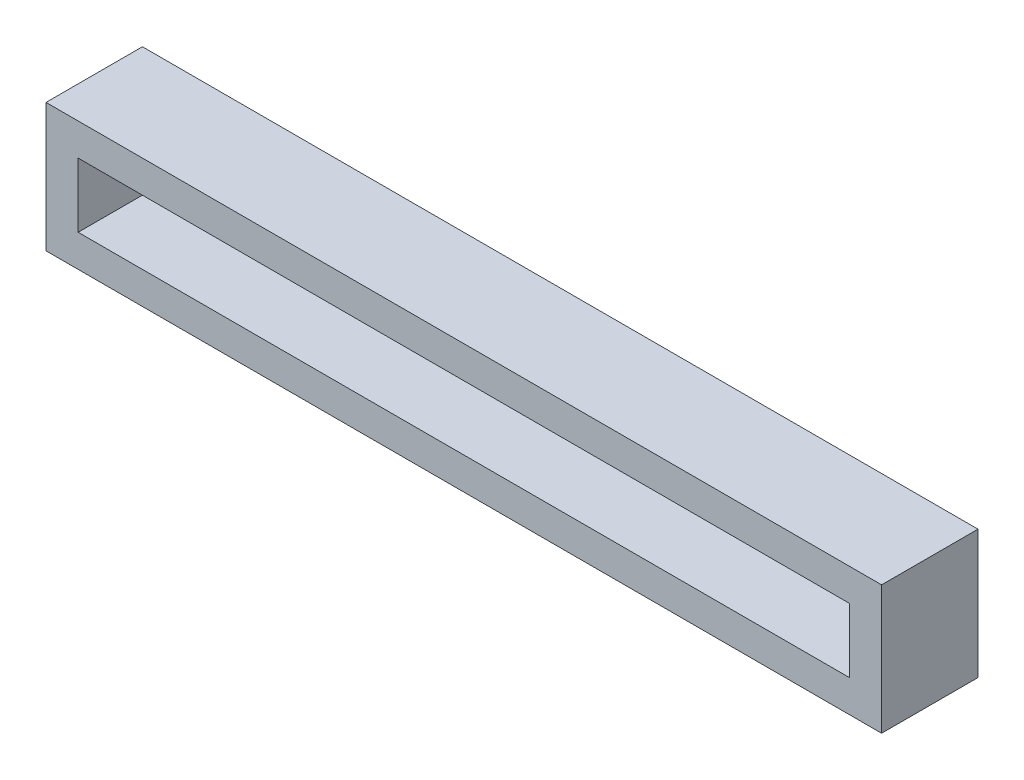
ISO-10303-21;
HEADER;
FILE_DESCRIPTION(('STEP AP214'),'2;1');
FILE_NAME('part.step','',(''),(''),'','','');
FILE_SCHEMA(('AUTOMOTIVE_DESIGN { 1 0 10303 214 1 1 1 1 }'));
ENDSEC;
DATA;
#1=APPLICATION_CONTEXT('core data for automotive mechanical design processes');
#2=APPLICATION_PROTOCOL_DEFINITION('international standard','automotive_design',2000,#1);
#3=PRODUCT_CONTEXT('',#1,'mechanical');
#4=PRODUCT('Part','Part','',(#3));
#5=PRODUCT_RELATED_PRODUCT_CATEGORY('part','',(#4));
#6=PRODUCT_DEFINITION_FORMATION('','',#4);
#7=PRODUCT_DEFINITION_CONTEXT('part definition',#1,'design');
#8=PRODUCT_DEFINITION('design','',#6,#7);
#9=PRODUCT_DEFINITION_SHAPE('','',#8);
#10=(LENGTH_UNIT() NAMED_UNIT(*) SI_UNIT(.MILLI.,.METRE.));
#11=(NAMED_UNIT(*) PLANE_ANGLE_UNIT() SI_UNIT($,.RADIAN.));
#12=(NAMED_UNIT(*) SI_UNIT($,.STERADIAN.) SOLID_ANGLE_UNIT());
#13=UNCERTAINTY_MEASURE_WITH_UNIT(LENGTH_MEASURE(1.E-05),#10,'distance_accuracy_value','');
#14=(GEOMETRIC_REPRESENTATION_CONTEXT(3) GLOBAL_UNCERTAINTY_ASSIGNED_CONTEXT((#13)) GLOBAL_UNIT_ASSIGNED_CONTEXT((#10,
#11,#12)) REPRESENTATION_CONTEXT('',''));
#15=CARTESIAN_POINT('',(0.,0.,0.));
#16=DIRECTION('',(0.,0.,1.));
#17=DIRECTION('',(1.,0.,0.));
#18=AXIS2_PLACEMENT_3D('',#15,#16,#17);
#19=CARTESIAN_POINT('',(0.,0.,15.));
#20=DIRECTION('',(0.,0.,1.));
#21=DIRECTION('',(1.,0.,0.));
#22=AXIS2_PLACEMENT_3D('',#19,#20,#21);
#23=PLANE('',#22);
#24=DIRECTION('',(0.,-1.,0.));
#25=VECTOR('',#24,1.);
#26=CARTESIAN_POINT('',(0.,20.,15.));
#27=LINE('',#26,#25);
#28=CARTESIAN_POINT('',(0.,20.,15.));
#29=VERTEX_POINT('',#28);
#30=CARTESIAN_POINT('',(0.,0.,15.));
#31=VERTEX_POINT('',#30);
#32=EDGE_CURVE('E134',#29,#31,#27,.T.);
#33=ORIENTED_EDGE('',*,*,#32,.T.);
#34=DIRECTION('',(1.,0.,0.));
#35=VECTOR('',#34,1.);
#36=CARTESIAN_POINT('',(0.,0.,15.));
#37=LINE('',#36,#35);
#38=CARTESIAN_POINT('',(130.,0.,15.));
#39=VERTEX_POINT('',#38);
#40=EDGE_CURVE('E137',#31,#39,#37,.T.);
#41=ORIENTED_EDGE('',*,*,#40,.T.);
#42=DIRECTION('',(0.,1.,0.));
#43=VECTOR('',#42,1.);
#44=CARTESIAN_POINT('',(130.,0.,15.));
#45=LINE('',#44,#43);
#46=CARTESIAN_POINT('',(130.,20.,15.));
#47=VERTEX_POINT('',#46);
#48=EDGE_CURVE('E140',#39,#47,#45,.T.);
#49=ORIENTED_EDGE('',*,*,#48,.T.);
#50=DIRECTION('',(-1.,0.,0.));
#51=VECTOR('',#50,1.);
#52=CARTESIAN_POINT('',(130.,20.,15.));
#53=LINE('',#52,#51);
#54=EDGE_CURVE('E142',#47,#29,#53,.T.);
#55=ORIENTED_EDGE('',*,*,#54,.T.);
#56=EDGE_LOOP('',(#33,#41,#49,#55));
#57=FACE_BOUND('',#56,.T.);
#58=DIRECTION('',(0.,-1.,0.));
#59=VECTOR('',#58,1.);
#60=CARTESIAN_POINT('',(5.,15.,15.));
#61=LINE('',#60,#59);
#62=CARTESIAN_POINT('',(5.,15.,15.));
#63=VERTEX_POINT('',#62);
#64=CARTESIAN_POINT('',(5.,5.,15.));
#65=VERTEX_POINT('',#64);
#66=EDGE_CURVE('E106',#63,#65,#61,.T.);
#67=ORIENTED_EDGE('',*,*,#66,.F.);
#68=DIRECTION('',(-1.,0.,0.));
#69=VECTOR('',#68,1.);
#70=CARTESIAN_POINT('',(125.,15.,15.));
#71=LINE('',#70,#69);
#72=CARTESIAN_POINT('',(125.,15.,15.));
#73=VERTEX_POINT('',#72);
#74=EDGE_CURVE('E98',#73,#63,#71,.T.);
#75=ORIENTED_EDGE('',*,*,#74,.F.);
#76=DIRECTION('',(0.,1.,0.));
#77=VECTOR('',#76,1.);
#78=CARTESIAN_POINT('',(125.,5.00000000000004,15.));
#79=LINE('',#78,#77);
#80=CARTESIAN_POINT('',(125.,5.00000000000004,15.));
#81=VERTEX_POINT('',#80);
#82=EDGE_CURVE('E120',#81,#73,#79,.T.);
#83=ORIENTED_EDGE('',*,*,#82,.F.);
#84=DIRECTION('',(1.,0.,0.));
#85=VECTOR('',#84,1.);
#86=CARTESIAN_POINT('',(5.,5.,15.));
#87=LINE('',#86,#85);
#88=EDGE_CURVE('E118',#65,#81,#87,.T.);
#89=ORIENTED_EDGE('',*,*,#88,.F.);
#90=EDGE_LOOP('',(#67,#75,#83,#89));
#91=FACE_BOUND('',#90,.T.);
#92=ADVANCED_FACE('F33',(#57,#91),#23,.T.);
#93=CARTESIAN_POINT('',(0.,0.,0.));
#94=DIRECTION('',(0.,0.,1.));
#95=DIRECTION('',(1.,0.,0.));
#96=AXIS2_PLACEMENT_3D('',#93,#94,#95);
#97=PLANE('',#96);
#98=DIRECTION('',(0.,-1.,0.));
#99=VECTOR('',#98,1.);
#100=CARTESIAN_POINT('',(0.,20.,0.));
#101=LINE('',#100,#99);
#102=CARTESIAN_POINT('',(0.,20.,0.));
#103=VERTEX_POINT('',#102);
#104=CARTESIAN_POINT('',(0.,0.,0.));
#105=VERTEX_POINT('',#104);
#106=EDGE_CURVE('E114',#103,#105,#101,.T.);
#107=ORIENTED_EDGE('',*,*,#106,.F.);
#108=DIRECTION('',(-1.,0.,0.));
#109=VECTOR('',#108,1.);
#110=CARTESIAN_POINT('',(130.,20.,0.));
#111=LINE('',#110,#109);
#112=CARTESIAN_POINT('',(130.,20.,0.));
#113=VERTEX_POINT('',#112);
#114=EDGE_CURVE('E138',#113,#103,#111,.T.);
#115=ORIENTED_EDGE('',*,*,#114,.F.);
#116=DIRECTION('',(0.,1.,0.));
#117=VECTOR('',#116,1.);
#118=CARTESIAN_POINT('',(130.,0.,0.));
#119=LINE('',#118,#117);
#120=CARTESIAN_POINT('',(130.,0.,0.));
#121=VERTEX_POINT('',#120);
#122=EDGE_CURVE('E149',#121,#113,#119,.T.);
#123=ORIENTED_EDGE('',*,*,#122,.F.);
#124=DIRECTION('',(1.,0.,0.));
#125=VECTOR('',#124,1.);
#126=CARTESIAN_POINT('',(0.,0.,0.));
#127=LINE('',#126,#125);
#128=EDGE_CURVE('E147',#105,#121,#127,.T.);
#129=ORIENTED_EDGE('',*,*,#128,.F.);
#130=EDGE_LOOP('',(#107,#115,#123,#129));
#131=FACE_BOUND('',#130,.T.);
#132=DIRECTION('',(-1.,0.,0.));
#133=VECTOR('',#132,1.);
#134=CARTESIAN_POINT('',(125.,15.,0.));
#135=LINE('',#134,#133);
#136=CARTESIAN_POINT('',(125.,15.,0.));
#137=VERTEX_POINT('',#136);
#138=CARTESIAN_POINT('',(5.,15.,0.));
#139=VERTEX_POINT('',#138);
#140=EDGE_CURVE('E56',#137,#139,#135,.T.);
#141=ORIENTED_EDGE('',*,*,#140,.T.);
#142=DIRECTION('',(0.,-1.,0.));
#143=VECTOR('',#142,1.);
#144=CARTESIAN_POINT('',(5.,15.,0.));
#145=LINE('',#144,#143);
#146=CARTESIAN_POINT('',(5.,5.,0.));
#147=VERTEX_POINT('',#146);
#148=EDGE_CURVE('E113',#139,#147,#145,.T.);
#149=ORIENTED_EDGE('',*,*,#148,.T.);
#150=DIRECTION('',(1.,0.,0.));
#151=VECTOR('',#150,1.);
#152=CARTESIAN_POINT('',(5.,5.,0.));
#153=LINE('',#152,#151);
#154=CARTESIAN_POINT('',(125.,5.00000000000004,0.));
#155=VERTEX_POINT('',#154);
#156=EDGE_CURVE('E126',#147,#155,#153,.T.);
#157=ORIENTED_EDGE('',*,*,#156,.T.);
#158=DIRECTION('',(0.,1.,0.));
#159=VECTOR('',#158,1.);
#160=CARTESIAN_POINT('',(125.,5.00000000000004,0.));
#161=LINE('',#160,#159);
#162=EDGE_CURVE('E107',#155,#137,#161,.T.);
#163=ORIENTED_EDGE('',*,*,#162,.T.);
#164=EDGE_LOOP('',(#141,#149,#157,#163));
#165=FACE_BOUND('',#164,.T.);
#166=ADVANCED_FACE('F167',(#131,#165),#97,.F.);
#167=CARTESIAN_POINT('',(0.,20.,15.));
#168=DIRECTION('',(1.,0.,0.));
#169=DIRECTION('',(0.,1.,0.));
#170=AXIS2_PLACEMENT_3D('',#167,#168,#169);
#171=PLANE('',#170);
#172=ORIENTED_EDGE('',*,*,#106,.T.);
#173=DIRECTION('',(0.,0.,-1.));
#174=VECTOR('',#173,1.);
#175=CARTESIAN_POINT('',(0.,0.,15.));
#176=LINE('',#175,#174);
#177=EDGE_CURVE('E11',#31,#105,#176,.T.);
#178=ORIENTED_EDGE('',*,*,#177,.F.);
#179=ORIENTED_EDGE('',*,*,#32,.F.);
#180=DIRECTION('',(0.,0.,-1.));
#181=VECTOR('',#180,1.);
#182=CARTESIAN_POINT('',(0.,20.,15.));
#183=LINE('',#182,#181);
#184=EDGE_CURVE('E144',#29,#103,#183,.T.);
#185=ORIENTED_EDGE('',*,*,#184,.T.);
#186=EDGE_LOOP('',(#172,#178,#179,#185));
#187=FACE_BOUND('',#186,.T.);
#188=ADVANCED_FACE('F35',(#187),#171,.F.);
#189=CARTESIAN_POINT('',(0.,0.,15.));
#190=DIRECTION('',(0.,1.,0.));
#191=DIRECTION('',(0.,0.,1.));
#192=AXIS2_PLACEMENT_3D('',#189,#190,#191);
#193=PLANE('',#192);
#194=ORIENTED_EDGE('',*,*,#128,.T.);
#195=DIRECTION('',(0.,0.,-1.));
#196=VECTOR('',#195,1.);
#197=CARTESIAN_POINT('',(130.,0.,15.));
#198=LINE('',#197,#196);
#199=EDGE_CURVE('E41',#39,#121,#198,.T.);
#200=ORIENTED_EDGE('',*,*,#199,.F.);
#201=ORIENTED_EDGE('',*,*,#40,.F.);
#202=ORIENTED_EDGE('',*,*,#177,.T.);
#203=EDGE_LOOP('',(#194,#200,#201,#202));
#204=FACE_BOUND('',#203,.T.);
#205=ADVANCED_FACE('F177',(#204),#193,.F.);
#206=CARTESIAN_POINT('',(130.,0.,15.));
#207=DIRECTION('',(-1.,0.,0.));
#208=DIRECTION('',(0.,0.,1.));
#209=AXIS2_PLACEMENT_3D('',#206,#207,#208);
#210=PLANE('',#209);
#211=ORIENTED_EDGE('',*,*,#122,.T.);
#212=DIRECTION('',(0.,0.,-1.));
#213=VECTOR('',#212,1.);
#214=CARTESIAN_POINT('',(130.,20.,15.));
#215=LINE('',#214,#213);
#216=EDGE_CURVE('E154',#47,#113,#215,.T.);
#217=ORIENTED_EDGE('',*,*,#216,.F.);
#218=ORIENTED_EDGE('',*,*,#48,.F.);
#219=ORIENTED_EDGE('',*,*,#199,.T.);
#220=EDGE_LOOP('',(#211,#217,#218,#219));
#221=FACE_BOUND('',#220,.T.);
#222=ADVANCED_FACE('F161',(#221),#210,.F.);
#223=CARTESIAN_POINT('',(130.,20.,15.));
#224=DIRECTION('',(0.,-1.,0.));
#225=DIRECTION('',(1.,0.,0.));
#226=AXIS2_PLACEMENT_3D('',#223,#224,#225);
#227=PLANE('',#226);
#228=ORIENTED_EDGE('',*,*,#114,.T.);
#229=ORIENTED_EDGE('',*,*,#184,.F.);
#230=ORIENTED_EDGE('',*,*,#54,.F.);
#231=ORIENTED_EDGE('',*,*,#216,.T.);
#232=EDGE_LOOP('',(#228,#229,#230,#231));
#233=FACE_BOUND('',#232,.T.);
#234=ADVANCED_FACE('F171',(#233),#227,.F.);
#235=CARTESIAN_POINT('',(125.,15.,15.));
#236=DIRECTION('',(0.,-1.,0.));
#237=DIRECTION('',(1.,0.,0.));
#238=AXIS2_PLACEMENT_3D('',#235,#236,#237);
#239=PLANE('',#238);
#240=ORIENTED_EDGE('',*,*,#140,.F.);
#241=DIRECTION('',(0.,0.,-1.));
#242=VECTOR('',#241,1.);
#243=CARTESIAN_POINT('',(125.,15.,15.));
#244=LINE('',#243,#242);
#245=EDGE_CURVE('E102',#73,#137,#244,.T.);
#246=ORIENTED_EDGE('',*,*,#245,.F.);
#247=ORIENTED_EDGE('',*,*,#74,.T.);
#248=DIRECTION('',(0.,0.,-1.));
#249=VECTOR('',#248,1.);
#250=CARTESIAN_POINT('',(5.,15.,15.));
#251=LINE('',#250,#249);
#252=EDGE_CURVE('E101',#63,#139,#251,.T.);
#253=ORIENTED_EDGE('',*,*,#252,.T.);
#254=EDGE_LOOP('',(#240,#246,#247,#253));
#255=FACE_BOUND('',#254,.T.);
#256=ADVANCED_FACE('F100',(#255),#239,.T.);
#257=CARTESIAN_POINT('',(5.,15.,15.));
#258=DIRECTION('',(1.,0.,0.));
#259=DIRECTION('',(0.,1.,0.));
#260=AXIS2_PLACEMENT_3D('',#257,#258,#259);
#261=PLANE('',#260);
#262=ORIENTED_EDGE('',*,*,#148,.F.);
#263=ORIENTED_EDGE('',*,*,#252,.F.);
#264=ORIENTED_EDGE('',*,*,#66,.T.);
#265=DIRECTION('',(0.,0.,-1.));
#266=VECTOR('',#265,1.);
#267=CARTESIAN_POINT('',(5.,5.,15.));
#268=LINE('',#267,#266);
#269=EDGE_CURVE('E115',#65,#147,#268,.T.);
#270=ORIENTED_EDGE('',*,*,#269,.T.);
#271=EDGE_LOOP('',(#262,#263,#264,#270));
#272=FACE_BOUND('',#271,.T.);
#273=ADVANCED_FACE('F110',(#272),#261,.T.);
#274=CARTESIAN_POINT('',(5.,5.,15.));
#275=DIRECTION('',(0.,1.,0.));
#276=DIRECTION('',(-1.,0.,0.));
#277=AXIS2_PLACEMENT_3D('',#274,#275,#276);
#278=PLANE('',#277);
#279=ORIENTED_EDGE('',*,*,#156,.F.);
#280=ORIENTED_EDGE('',*,*,#269,.F.);
#281=ORIENTED_EDGE('',*,*,#88,.T.);
#282=DIRECTION('',(0.,0.,-1.));
#283=VECTOR('',#282,1.);
#284=CARTESIAN_POINT('',(125.,5.00000000000004,15.));
#285=LINE('',#284,#283);
#286=EDGE_CURVE('E48',#81,#155,#285,.T.);
#287=ORIENTED_EDGE('',*,*,#286,.T.);
#288=EDGE_LOOP('',(#279,#280,#281,#287));
#289=FACE_BOUND('',#288,.T.);
#290=ADVANCED_FACE('F200',(#289),#278,.T.);
#291=CARTESIAN_POINT('',(125.,5.00000000000004,15.));
#292=DIRECTION('',(-1.,0.,0.));
#293=DIRECTION('',(0.,0.,1.));
#294=AXIS2_PLACEMENT_3D('',#291,#292,#293);
#295=PLANE('',#294);
#296=ORIENTED_EDGE('',*,*,#162,.F.);
#297=ORIENTED_EDGE('',*,*,#286,.F.);
#298=ORIENTED_EDGE('',*,*,#82,.T.);
#299=ORIENTED_EDGE('',*,*,#245,.T.);
#300=EDGE_LOOP('',(#296,#297,#298,#299));
#301=FACE_BOUND('',#300,.T.);
#302=ADVANCED_FACE('F204',(#301),#295,.T.);
#303=CLOSED_SHELL('',(#92,#166,#188,#205,#222,#234,#256,#273,#290,#302));
#304=MANIFOLD_SOLID_BREP('B2',#303);
#305=ADVANCED_BREP_SHAPE_REPRESENTATION('',(#18,#304),#14);
#306=SHAPE_DEFINITION_REPRESENTATION(#9,#305);
ENDSEC;
END-ISO-10303-21;
